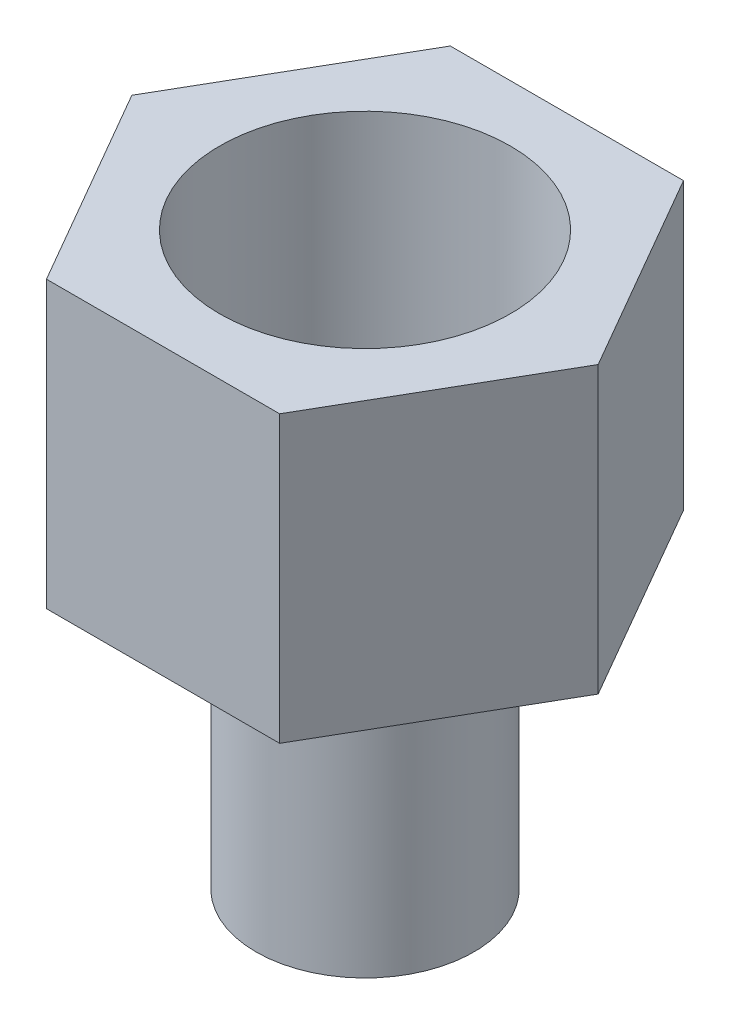
ISO-10303-21;
HEADER;
FILE_DESCRIPTION(('STEP AP214'),'2;1');
FILE_NAME('part.step','',(''),(''),'','','');
FILE_SCHEMA(('AUTOMOTIVE_DESIGN { 1 0 10303 214 1 1 1 1 }'));
ENDSEC;
DATA;
#1=APPLICATION_CONTEXT('core data for automotive mechanical design processes');
#2=APPLICATION_PROTOCOL_DEFINITION('international standard','automotive_design',2000,#1);
#3=PRODUCT_CONTEXT('',#1,'mechanical');
#4=PRODUCT('Part','Part','',(#3));
#5=PRODUCT_RELATED_PRODUCT_CATEGORY('part','',(#4));
#6=PRODUCT_DEFINITION_FORMATION('','',#4);
#7=PRODUCT_DEFINITION_CONTEXT('part definition',#1,'design');
#8=PRODUCT_DEFINITION('design','',#6,#7);
#9=PRODUCT_DEFINITION_SHAPE('','',#8);
#10=(LENGTH_UNIT() NAMED_UNIT(*) SI_UNIT(.MILLI.,.METRE.));
#11=(NAMED_UNIT(*) PLANE_ANGLE_UNIT() SI_UNIT($,.RADIAN.));
#12=(NAMED_UNIT(*) SI_UNIT($,.STERADIAN.) SOLID_ANGLE_UNIT());
#13=UNCERTAINTY_MEASURE_WITH_UNIT(LENGTH_MEASURE(1.E-05),#10,'distance_accuracy_value','');
#14=(GEOMETRIC_REPRESENTATION_CONTEXT(3) GLOBAL_UNCERTAINTY_ASSIGNED_CONTEXT((#13)) GLOBAL_UNIT_ASSIGNED_CONTEXT((#10,
#11,#12)) REPRESENTATION_CONTEXT('',''));
#15=CARTESIAN_POINT('',(0.,0.,0.));
#16=DIRECTION('',(0.,0.,1.));
#17=DIRECTION('',(1.,0.,0.));
#18=AXIS2_PLACEMENT_3D('',#15,#16,#17);
#19=CARTESIAN_POINT('',(10.9985226280624,-13.462,0.));
#20=DIRECTION('',(0.866025403784439,0.,-0.5));
#21=DIRECTION('',(-0.5,0.,-0.866025403784439));
#22=AXIS2_PLACEMENT_3D('',#19,#20,#21);
#23=PLANE('',#22);
#24=DIRECTION('',(-0.5,0.,-0.866025403784439));
#25=VECTOR('',#24,1.);
#26=CARTESIAN_POINT('',(10.9985226280624,0.,0.));
#27=LINE('',#26,#25);
#28=CARTESIAN_POINT('',(10.9985226280624,0.,0.));
#29=VERTEX_POINT('',#28);
#30=CARTESIAN_POINT('',(5.49926131403118,0.,-9.525));
#31=VERTEX_POINT('',#30);
#32=EDGE_CURVE('E122',#29,#31,#27,.T.);
#33=ORIENTED_EDGE('',*,*,#32,.F.);
#34=DIRECTION('',(0.,1.,0.));
#35=VECTOR('',#34,1.);
#36=CARTESIAN_POINT('',(10.9985226280624,-13.462,0.));
#37=LINE('',#36,#35);
#38=CARTESIAN_POINT('',(10.9985226280624,-13.462,0.));
#39=VERTEX_POINT('',#38);
#40=EDGE_CURVE('E44',#39,#29,#37,.T.);
#41=ORIENTED_EDGE('',*,*,#40,.F.);
#42=DIRECTION('',(-0.5,0.,-0.866025403784439));
#43=VECTOR('',#42,1.);
#44=CARTESIAN_POINT('',(10.9985226280624,-13.462,0.));
#45=LINE('',#44,#43);
#46=CARTESIAN_POINT('',(5.49926131403118,-13.462,-9.525));
#47=VERTEX_POINT('',#46);
#48=EDGE_CURVE('E138',#39,#47,#45,.T.);
#49=ORIENTED_EDGE('',*,*,#48,.T.);
#50=DIRECTION('',(0.,1.,0.));
#51=VECTOR('',#50,1.);
#52=CARTESIAN_POINT('',(5.49926131403118,-13.462,-9.525));
#53=LINE('',#52,#51);
#54=EDGE_CURVE('E86',#47,#31,#53,.T.);
#55=ORIENTED_EDGE('',*,*,#54,.T.);
#56=EDGE_LOOP('',(#33,#41,#49,#55));
#57=FACE_BOUND('',#56,.T.);
#58=ADVANCED_FACE('F36',(#57),#23,.T.);
#59=CARTESIAN_POINT('',(5.49926131403119,-13.462,9.525));
#60=DIRECTION('',(0.866025403784439,0.,0.5));
#61=DIRECTION('',(0.5,0.,-0.866025403784439));
#62=AXIS2_PLACEMENT_3D('',#59,#60,#61);
#63=PLANE('',#62);
#64=DIRECTION('',(0.5,0.,-0.866025403784439));
#65=VECTOR('',#64,1.);
#66=CARTESIAN_POINT('',(5.49926131403119,0.,9.525));
#67=LINE('',#66,#65);
#68=CARTESIAN_POINT('',(5.49926131403119,0.,9.525));
#69=VERTEX_POINT('',#68);
#70=EDGE_CURVE('E135',#69,#29,#67,.T.);
#71=ORIENTED_EDGE('',*,*,#70,.F.);
#72=DIRECTION('',(0.,1.,0.));
#73=VECTOR('',#72,1.);
#74=CARTESIAN_POINT('',(5.49926131403119,-13.462,9.525));
#75=LINE('',#74,#73);
#76=CARTESIAN_POINT('',(5.49926131403119,-13.462,9.525));
#77=VERTEX_POINT('',#76);
#78=EDGE_CURVE('E74',#77,#69,#75,.T.);
#79=ORIENTED_EDGE('',*,*,#78,.F.);
#80=DIRECTION('',(0.5,0.,-0.866025403784439));
#81=VECTOR('',#80,1.);
#82=CARTESIAN_POINT('',(5.49926131403119,-13.462,9.525));
#83=LINE('',#82,#81);
#84=EDGE_CURVE('E112',#77,#39,#83,.T.);
#85=ORIENTED_EDGE('',*,*,#84,.T.);
#86=ORIENTED_EDGE('',*,*,#40,.T.);
#87=EDGE_LOOP('',(#71,#79,#85,#86));
#88=FACE_BOUND('',#87,.T.);
#89=ADVANCED_FACE('F147',(#88),#63,.T.);
#90=CARTESIAN_POINT('',(-5.49926131403119,-13.462,9.525));
#91=DIRECTION('',(0.,0.,1.));
#92=DIRECTION('',(1.,0.,0.));
#93=AXIS2_PLACEMENT_3D('',#90,#91,#92);
#94=PLANE('',#93);
#95=DIRECTION('',(1.,0.,0.));
#96=VECTOR('',#95,1.);
#97=CARTESIAN_POINT('',(-5.49926131403119,0.,9.525));
#98=LINE('',#97,#96);
#99=CARTESIAN_POINT('',(-5.49926131403119,0.,9.525));
#100=VERTEX_POINT('',#99);
#101=EDGE_CURVE('E99',#100,#69,#98,.T.);
#102=ORIENTED_EDGE('',*,*,#101,.F.);
#103=DIRECTION('',(0.,1.,0.));
#104=VECTOR('',#103,1.);
#105=CARTESIAN_POINT('',(-5.49926131403119,-13.462,9.525));
#106=LINE('',#105,#104);
#107=CARTESIAN_POINT('',(-5.49926131403119,-13.462,9.525));
#108=VERTEX_POINT('',#107);
#109=EDGE_CURVE('E94',#108,#100,#106,.T.);
#110=ORIENTED_EDGE('',*,*,#109,.F.);
#111=DIRECTION('',(1.,0.,0.));
#112=VECTOR('',#111,1.);
#113=CARTESIAN_POINT('',(-5.49926131403119,-13.462,9.525));
#114=LINE('',#113,#112);
#115=EDGE_CURVE('E97',#108,#77,#114,.T.);
#116=ORIENTED_EDGE('',*,*,#115,.T.);
#117=ORIENTED_EDGE('',*,*,#78,.T.);
#118=EDGE_LOOP('',(#102,#110,#116,#117));
#119=FACE_BOUND('',#118,.T.);
#120=ADVANCED_FACE('F96',(#119),#94,.T.);
#121=CARTESIAN_POINT('',(-10.9985226280624,-13.462,0.));
#122=DIRECTION('',(-0.866025403784439,0.,0.5));
#123=DIRECTION('',(0.5,0.,0.866025403784439));
#124=AXIS2_PLACEMENT_3D('',#121,#122,#123);
#125=PLANE('',#124);
#126=DIRECTION('',(0.5,0.,0.866025403784439));
#127=VECTOR('',#126,1.);
#128=CARTESIAN_POINT('',(-10.9985226280624,0.,0.));
#129=LINE('',#128,#127);
#130=CARTESIAN_POINT('',(-10.9985226280624,0.,0.));
#131=VERTEX_POINT('',#130);
#132=EDGE_CURVE('E132',#131,#100,#129,.T.);
#133=ORIENTED_EDGE('',*,*,#132,.F.);
#134=DIRECTION('',(0.,1.,0.));
#135=VECTOR('',#134,1.);
#136=CARTESIAN_POINT('',(-10.9985226280624,-13.462,0.));
#137=LINE('',#136,#135);
#138=CARTESIAN_POINT('',(-10.9985226280624,-13.462,0.));
#139=VERTEX_POINT('',#138);
#140=EDGE_CURVE('E104',#139,#131,#137,.T.);
#141=ORIENTED_EDGE('',*,*,#140,.F.);
#142=DIRECTION('',(0.5,0.,0.866025403784439));
#143=VECTOR('',#142,1.);
#144=CARTESIAN_POINT('',(-10.9985226280624,-13.462,0.));
#145=LINE('',#144,#143);
#146=EDGE_CURVE('E110',#139,#108,#145,.T.);
#147=ORIENTED_EDGE('',*,*,#146,.T.);
#148=ORIENTED_EDGE('',*,*,#109,.T.);
#149=EDGE_LOOP('',(#133,#141,#147,#148));
#150=FACE_BOUND('',#149,.T.);
#151=ADVANCED_FACE('F114',(#150),#125,.T.);
#152=CARTESIAN_POINT('',(-5.49926131403118,-13.462,-9.525));
#153=DIRECTION('',(-0.866025403784439,0.,-0.5));
#154=DIRECTION('',(-0.5,0.,0.866025403784439));
#155=AXIS2_PLACEMENT_3D('',#152,#153,#154);
#156=PLANE('',#155);
#157=DIRECTION('',(-0.5,0.,0.866025403784439));
#158=VECTOR('',#157,1.);
#159=CARTESIAN_POINT('',(-5.49926131403118,0.,-9.525));
#160=LINE('',#159,#158);
#161=CARTESIAN_POINT('',(-5.49926131403118,0.,-9.525));
#162=VERTEX_POINT('',#161);
#163=EDGE_CURVE('E129',#162,#131,#160,.T.);
#164=ORIENTED_EDGE('',*,*,#163,.F.);
#165=DIRECTION('',(0.,1.,0.));
#166=VECTOR('',#165,1.);
#167=CARTESIAN_POINT('',(-5.49926131403118,-13.462,-9.525));
#168=LINE('',#167,#166);
#169=CARTESIAN_POINT('',(-5.49926131403118,-13.462,-9.525));
#170=VERTEX_POINT('',#169);
#171=EDGE_CURVE('E142',#170,#162,#168,.T.);
#172=ORIENTED_EDGE('',*,*,#171,.F.);
#173=DIRECTION('',(-0.5,0.,0.866025403784439));
#174=VECTOR('',#173,1.);
#175=CARTESIAN_POINT('',(-5.49926131403118,-13.462,-9.525));
#176=LINE('',#175,#174);
#177=EDGE_CURVE('E115',#170,#139,#176,.T.);
#178=ORIENTED_EDGE('',*,*,#177,.T.);
#179=ORIENTED_EDGE('',*,*,#140,.T.);
#180=EDGE_LOOP('',(#164,#172,#178,#179));
#181=FACE_BOUND('',#180,.T.);
#182=ADVANCED_FACE('F160',(#181),#156,.T.);
#183=CARTESIAN_POINT('',(5.49926131403118,-13.462,-9.525));
#184=DIRECTION('',(0.,0.,-1.));
#185=DIRECTION('',(-1.,0.,0.));
#186=AXIS2_PLACEMENT_3D('',#183,#184,#185);
#187=PLANE('',#186);
#188=DIRECTION('',(-1.,0.,0.));
#189=VECTOR('',#188,1.);
#190=CARTESIAN_POINT('',(5.49926131403118,0.,-9.525));
#191=LINE('',#190,#189);
#192=EDGE_CURVE('E125',#31,#162,#191,.T.);
#193=ORIENTED_EDGE('',*,*,#192,.F.);
#194=ORIENTED_EDGE('',*,*,#54,.F.);
#195=DIRECTION('',(-1.,0.,0.));
#196=VECTOR('',#195,1.);
#197=CARTESIAN_POINT('',(5.49926131403118,-13.462,-9.525));
#198=LINE('',#197,#196);
#199=EDGE_CURVE('E117',#47,#170,#198,.T.);
#200=ORIENTED_EDGE('',*,*,#199,.T.);
#201=ORIENTED_EDGE('',*,*,#171,.T.);
#202=EDGE_LOOP('',(#193,#194,#200,#201));
#203=FACE_BOUND('',#202,.T.);
#204=ADVANCED_FACE('F143',(#203),#187,.T.);
#205=CARTESIAN_POINT('',(0.,-13.462,0.));
#206=DIRECTION('',(0.,1.,0.));
#207=DIRECTION('',(0.,0.,1.));
#208=AXIS2_PLACEMENT_3D('',#205,#206,#207);
#209=PLANE('',#208);
#210=CARTESIAN_POINT('',(0.,-13.462,0.));
#211=DIRECTION('',(0.,1.,0.));
#212=DIRECTION('',(0.,0.,1.));
#213=AXIS2_PLACEMENT_3D('',#210,#211,#212);
#214=CIRCLE('',#213,5.1435);
#215=CARTESIAN_POINT('',(0.,-13.462,5.1435));
#216=VERTEX_POINT('',#215);
#217=EDGE_CURVE('E12',#216,#216,#214,.F.);
#218=ORIENTED_EDGE('',*,*,#217,.F.);
#219=EDGE_LOOP('',(#218));
#220=FACE_BOUND('',#219,.T.);
#221=ORIENTED_EDGE('',*,*,#48,.F.);
#222=ORIENTED_EDGE('',*,*,#84,.F.);
#223=ORIENTED_EDGE('',*,*,#115,.F.);
#224=ORIENTED_EDGE('',*,*,#146,.F.);
#225=ORIENTED_EDGE('',*,*,#177,.F.);
#226=ORIENTED_EDGE('',*,*,#199,.F.);
#227=EDGE_LOOP('',(#221,#222,#223,#224,#225,#226));
#228=FACE_BOUND('',#227,.T.);
#229=ADVANCED_FACE('F108',(#220,#228),#209,.F.);
#230=CARTESIAN_POINT('',(0.,0.,0.));
#231=DIRECTION('',(0.,1.,0.));
#232=DIRECTION('',(0.,0.,1.));
#233=AXIS2_PLACEMENT_3D('',#230,#231,#232);
#234=PLANE('',#233);
#235=CARTESIAN_POINT('',(0.,0.,0.));
#236=DIRECTION('',(0.,1.,0.));
#237=DIRECTION('',(0.,0.,1.));
#238=AXIS2_PLACEMENT_3D('',#235,#236,#237);
#239=CIRCLE('',#238,6.858);
#240=CARTESIAN_POINT('',(0.,0.,6.858));
#241=VERTEX_POINT('',#240);
#242=EDGE_CURVE('E208',#241,#241,#239,.T.);
#243=ORIENTED_EDGE('',*,*,#242,.F.);
#244=EDGE_LOOP('',(#243));
#245=FACE_BOUND('',#244,.T.);
#246=ORIENTED_EDGE('',*,*,#32,.T.);
#247=ORIENTED_EDGE('',*,*,#192,.T.);
#248=ORIENTED_EDGE('',*,*,#163,.T.);
#249=ORIENTED_EDGE('',*,*,#132,.T.);
#250=ORIENTED_EDGE('',*,*,#101,.T.);
#251=ORIENTED_EDGE('',*,*,#70,.T.);
#252=EDGE_LOOP('',(#246,#247,#248,#249,#250,#251));
#253=FACE_BOUND('',#252,.T.);
#254=ADVANCED_FACE('F146',(#245,#253),#234,.T.);
#255=CARTESIAN_POINT('',(0.,-32.8593532215094,0.));
#256=DIRECTION('',(0.,1.,0.));
#257=DIRECTION('',(0.,0.,1.));
#258=AXIS2_PLACEMENT_3D('',#255,#256,#257);
#259=CYLINDRICAL_SURFACE('',#258,6.858);
#260=CARTESIAN_POINT('',(0.,-12.954,0.));
#261=DIRECTION('',(0.,1.,0.));
#262=DIRECTION('',(0.,0.,1.));
#263=AXIS2_PLACEMENT_3D('',#260,#261,#262);
#264=CIRCLE('',#263,6.858);
#265=CARTESIAN_POINT('',(0.,-12.954,6.858));
#266=VERTEX_POINT('',#265);
#267=EDGE_CURVE('E126',#266,#266,#264,.F.);
#268=ORIENTED_EDGE('',*,*,#267,.T.);
#269=EDGE_LOOP('',(#268));
#270=FACE_BOUND('',#269,.T.);
#271=ORIENTED_EDGE('',*,*,#242,.T.);
#272=EDGE_LOOP('',(#271));
#273=FACE_BOUND('',#272,.T.);
#274=ADVANCED_FACE('F171',(#270,#273),#259,.F.);
#275=CARTESIAN_POINT('',(0.,-12.954,0.));
#276=DIRECTION('',(0.,1.,0.));
#277=DIRECTION('',(0.,0.,1.));
#278=AXIS2_PLACEMENT_3D('',#275,#276,#277);
#279=PLANE('',#278);
#280=CARTESIAN_POINT('',(0.,-12.954,0.));
#281=DIRECTION('',(0.,1.,0.));
#282=DIRECTION('',(0.,0.,1.));
#283=AXIS2_PLACEMENT_3D('',#280,#281,#282);
#284=CIRCLE('',#283,2.794);
#285=CARTESIAN_POINT('',(0.,-12.954,2.794));
#286=VERTEX_POINT('',#285);
#287=EDGE_CURVE('E198',#286,#286,#284,.T.);
#288=ORIENTED_EDGE('',*,*,#287,.F.);
#289=EDGE_LOOP('',(#288));
#290=FACE_BOUND('',#289,.T.);
#291=ORIENTED_EDGE('',*,*,#267,.F.);
#292=EDGE_LOOP('',(#291));
#293=FACE_BOUND('',#292,.T.);
#294=ADVANCED_FACE('F177',(#290,#293),#279,.T.);
#295=CARTESIAN_POINT('',(0.,-26.924,0.));
#296=DIRECTION('',(0.,1.,0.));
#297=DIRECTION('',(0.,0.,1.));
#298=AXIS2_PLACEMENT_3D('',#295,#296,#297);
#299=CYLINDRICAL_SURFACE('',#298,5.1435);
#300=CARTESIAN_POINT('',(0.,-26.924,0.));
#301=DIRECTION('',(0.,-1.,0.));
#302=DIRECTION('',(0.,0.,-1.));
#303=AXIS2_PLACEMENT_3D('',#300,#301,#302);
#304=CIRCLE('',#303,5.1435);
#305=CARTESIAN_POINT('',(0.,-26.924,-5.1435));
#306=VERTEX_POINT('',#305);
#307=EDGE_CURVE('E203',#306,#306,#304,.T.);
#308=ORIENTED_EDGE('',*,*,#307,.F.);
#309=EDGE_LOOP('',(#308));
#310=FACE_BOUND('',#309,.T.);
#311=ORIENTED_EDGE('',*,*,#217,.T.);
#312=EDGE_LOOP('',(#311));
#313=FACE_BOUND('',#312,.T.);
#314=ADVANCED_FACE('F181',(#310,#313),#299,.T.);
#315=CARTESIAN_POINT('',(0.,-26.924,0.));
#316=DIRECTION('',(0.,-1.,0.));
#317=DIRECTION('',(0.,0.,-1.));
#318=AXIS2_PLACEMENT_3D('',#315,#316,#317);
#319=PLANE('',#318);
#320=CARTESIAN_POINT('',(0.,-26.924,0.));
#321=DIRECTION('',(0.,-1.,0.));
#322=DIRECTION('',(0.,0.,-1.));
#323=AXIS2_PLACEMENT_3D('',#320,#321,#322);
#324=CIRCLE('',#323,2.794);
#325=CARTESIAN_POINT('',(0.,-26.924,-2.794));
#326=VERTEX_POINT('',#325);
#327=EDGE_CURVE('E201',#326,#326,#324,.T.);
#328=ORIENTED_EDGE('',*,*,#327,.F.);
#329=EDGE_LOOP('',(#328));
#330=FACE_BOUND('',#329,.T.);
#331=ORIENTED_EDGE('',*,*,#307,.T.);
#332=EDGE_LOOP('',(#331));
#333=FACE_BOUND('',#332,.T.);
#334=ADVANCED_FACE('F185',(#330,#333),#319,.T.);
#335=CARTESIAN_POINT('',(0.,0.,0.));
#336=DIRECTION('',(0.,-1.,0.));
#337=DIRECTION('',(0.,0.,-1.));
#338=AXIS2_PLACEMENT_3D('',#335,#336,#337);
#339=CYLINDRICAL_SURFACE('',#338,2.794);
#340=ORIENTED_EDGE('',*,*,#287,.T.);
#341=EDGE_LOOP('',(#340));
#342=FACE_BOUND('',#341,.T.);
#343=ORIENTED_EDGE('',*,*,#327,.T.);
#344=EDGE_LOOP('',(#343));
#345=FACE_BOUND('',#344,.T.);
#346=ADVANCED_FACE('F189',(#342,#345),#339,.F.);
#347=CLOSED_SHELL('',(#58,#89,#120,#151,#182,#204,#229,#254,#274,#294,#314,#334,#346));
#348=MANIFOLD_SOLID_BREP('B2',#347);
#349=ADVANCED_BREP_SHAPE_REPRESENTATION('',(#18,#348),#14);
#350=SHAPE_DEFINITION_REPRESENTATION(#9,#349);
ENDSEC;
END-ISO-10303-21;
